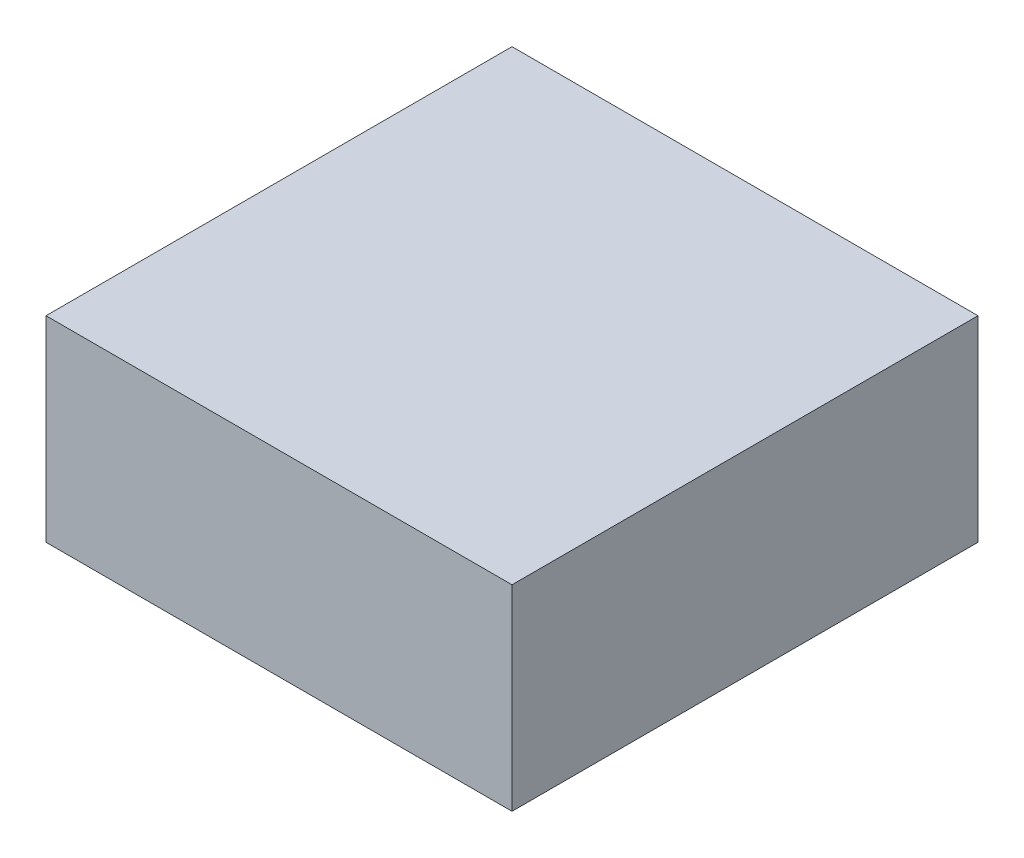
ISO-10303-21;
HEADER;
FILE_DESCRIPTION(('STEP AP214'),'2;1');
FILE_NAME('part.step','',(''),(''),'','','');
FILE_SCHEMA(('AUTOMOTIVE_DESIGN { 1 0 10303 214 1 1 1 1 }'));
ENDSEC;
DATA;
#1=APPLICATION_CONTEXT('core data for automotive mechanical design processes');
#2=APPLICATION_PROTOCOL_DEFINITION('international standard','automotive_design',2000,#1);
#3=PRODUCT_CONTEXT('',#1,'mechanical');
#4=PRODUCT('Part','Part','',(#3));
#5=PRODUCT_RELATED_PRODUCT_CATEGORY('part','',(#4));
#6=PRODUCT_DEFINITION_FORMATION('','',#4);
#7=PRODUCT_DEFINITION_CONTEXT('part definition',#1,'design');
#8=PRODUCT_DEFINITION('design','',#6,#7);
#9=PRODUCT_DEFINITION_SHAPE('','',#8);
#10=(LENGTH_UNIT() NAMED_UNIT(*) SI_UNIT(.MILLI.,.METRE.));
#11=(NAMED_UNIT(*) PLANE_ANGLE_UNIT() SI_UNIT($,.RADIAN.));
#12=(NAMED_UNIT(*) SI_UNIT($,.STERADIAN.) SOLID_ANGLE_UNIT());
#13=UNCERTAINTY_MEASURE_WITH_UNIT(LENGTH_MEASURE(1.E-05),#10,'distance_accuracy_value','');
#14=(GEOMETRIC_REPRESENTATION_CONTEXT(3) GLOBAL_UNCERTAINTY_ASSIGNED_CONTEXT((#13)) GLOBAL_UNIT_ASSIGNED_CONTEXT((#10,
#11,#12)) REPRESENTATION_CONTEXT('',''));
#15=CARTESIAN_POINT('',(0.,0.,0.));
#16=DIRECTION('',(0.,0.,1.));
#17=DIRECTION('',(1.,0.,0.));
#18=AXIS2_PLACEMENT_3D('',#15,#16,#17);
#19=CARTESIAN_POINT('',(0.47500032,0.20000214,0.));
#20=DIRECTION('',(0.,-1.,0.));
#21=DIRECTION('',(0.,0.,-1.));
#22=AXIS2_PLACEMENT_3D('',#19,#20,#21);
#23=PLANE('',#22);
#24=DIRECTION('',(0.,0.,-1.));
#25=VECTOR('',#24,1.);
#26=CARTESIAN_POINT('',(-0.47499778,0.20000214,0.));
#27=LINE('',#26,#25);
#28=CARTESIAN_POINT('',(-0.47499778,0.20000214,0.));
#29=VERTEX_POINT('',#28);
#30=CARTESIAN_POINT('',(-0.47499778,0.20000214,0.95000064));
#31=VERTEX_POINT('',#30);
#32=EDGE_CURVE('E20',#29,#31,#27,.F.);
#33=ORIENTED_EDGE('',*,*,#32,.T.);
#34=DIRECTION('',(-1.,0.,0.));
#35=VECTOR('',#34,1.);
#36=CARTESIAN_POINT('',(-0.47499778,0.20000214,0.95000064));
#37=LINE('',#36,#35);
#38=CARTESIAN_POINT('',(0.47500032,0.20000214,0.95000064));
#39=VERTEX_POINT('',#38);
#40=EDGE_CURVE('E55',#31,#39,#37,.F.);
#41=ORIENTED_EDGE('',*,*,#40,.T.);
#42=DIRECTION('',(0.,0.,1.));
#43=VECTOR('',#42,1.);
#44=CARTESIAN_POINT('',(0.47500032,0.20000214,0.));
#45=LINE('',#44,#43);
#46=CARTESIAN_POINT('',(0.47500032,0.20000214,0.));
#47=VERTEX_POINT('',#46);
#48=EDGE_CURVE('E76',#39,#47,#45,.F.);
#49=ORIENTED_EDGE('',*,*,#48,.T.);
#50=DIRECTION('',(-1.,0.,0.));
#51=VECTOR('',#50,1.);
#52=CARTESIAN_POINT('',(-0.47499778,0.20000214,0.));
#53=LINE('',#52,#51);
#54=EDGE_CURVE('E58',#29,#47,#53,.F.);
#55=ORIENTED_EDGE('',*,*,#54,.F.);
#56=EDGE_LOOP('',(#33,#41,#49,#55));
#57=FACE_BOUND('',#56,.T.);
#58=ADVANCED_FACE('F17',(#57),#23,.F.);
#59=CARTESIAN_POINT('',(-0.47499778,0.20000214,0.));
#60=DIRECTION('',(1.,0.,0.));
#61=DIRECTION('',(0.,0.,-1.));
#62=AXIS2_PLACEMENT_3D('',#59,#60,#61);
#63=PLANE('',#62);
#64=DIRECTION('',(0.,0.,1.));
#65=VECTOR('',#64,1.);
#66=CARTESIAN_POINT('',(-0.47499778,-0.1999996,0.));
#67=LINE('',#66,#65);
#68=CARTESIAN_POINT('',(-0.47499778,-0.1999996,0.));
#69=VERTEX_POINT('',#68);
#70=CARTESIAN_POINT('',(-0.47499778,-0.1999996,0.95000064));
#71=VERTEX_POINT('',#70);
#72=EDGE_CURVE('E73',#69,#71,#67,.T.);
#73=ORIENTED_EDGE('',*,*,#72,.T.);
#74=DIRECTION('',(0.,1.,0.));
#75=VECTOR('',#74,1.);
#76=CARTESIAN_POINT('',(-0.47499778,-0.1999996,0.95000064));
#77=LINE('',#76,#75);
#78=EDGE_CURVE('E63',#71,#31,#77,.T.);
#79=ORIENTED_EDGE('',*,*,#78,.T.);
#80=ORIENTED_EDGE('',*,*,#32,.F.);
#81=DIRECTION('',(0.,1.,0.));
#82=VECTOR('',#81,1.);
#83=CARTESIAN_POINT('',(-0.47499778,-0.1999996,0.));
#84=LINE('',#83,#82);
#85=EDGE_CURVE('E78',#69,#29,#84,.T.);
#86=ORIENTED_EDGE('',*,*,#85,.F.);
#87=EDGE_LOOP('',(#73,#79,#80,#86));
#88=FACE_BOUND('',#87,.T.);
#89=ADVANCED_FACE('F72',(#88),#63,.F.);
#90=CARTESIAN_POINT('',(-0.47499778,-0.1999996,0.95000064));
#91=DIRECTION('',(0.,0.,-1.));
#92=DIRECTION('',(-1.,0.,0.));
#93=AXIS2_PLACEMENT_3D('',#90,#91,#92);
#94=PLANE('',#93);
#95=DIRECTION('',(0.,1.,0.));
#96=VECTOR('',#95,1.);
#97=CARTESIAN_POINT('',(0.47500032,-0.1999996,0.95000064));
#98=LINE('',#97,#96);
#99=CARTESIAN_POINT('',(0.47500032,-0.1999996,0.95000064));
#100=VERTEX_POINT('',#99);
#101=EDGE_CURVE('E69',#100,#39,#98,.T.);
#102=ORIENTED_EDGE('',*,*,#101,.T.);
#103=ORIENTED_EDGE('',*,*,#40,.F.);
#104=ORIENTED_EDGE('',*,*,#78,.F.);
#105=DIRECTION('',(1.,0.,0.));
#106=VECTOR('',#105,1.);
#107=CARTESIAN_POINT('',(-0.47499778,-0.1999996,0.95000064));
#108=LINE('',#107,#106);
#109=EDGE_CURVE('E83',#71,#100,#108,.T.);
#110=ORIENTED_EDGE('',*,*,#109,.T.);
#111=EDGE_LOOP('',(#102,#103,#104,#110));
#112=FACE_BOUND('',#111,.T.);
#113=ADVANCED_FACE('F66',(#112),#94,.F.);
#114=CARTESIAN_POINT('',(0.47500032,-0.1999996,0.));
#115=DIRECTION('',(-1.,0.,0.));
#116=DIRECTION('',(0.,0.,1.));
#117=AXIS2_PLACEMENT_3D('',#114,#115,#116);
#118=PLANE('',#117);
#119=ORIENTED_EDGE('',*,*,#48,.F.);
#120=ORIENTED_EDGE('',*,*,#101,.F.);
#121=DIRECTION('',(0.,0.,1.));
#122=VECTOR('',#121,1.);
#123=CARTESIAN_POINT('',(0.47500032,-0.1999996,0.));
#124=LINE('',#123,#122);
#125=CARTESIAN_POINT('',(0.47500032,-0.1999996,0.));
#126=VERTEX_POINT('',#125);
#127=EDGE_CURVE('E26',#100,#126,#124,.F.);
#128=ORIENTED_EDGE('',*,*,#127,.T.);
#129=DIRECTION('',(0.,1.,0.));
#130=VECTOR('',#129,1.);
#131=CARTESIAN_POINT('',(0.47500032,-0.1999996,0.));
#132=LINE('',#131,#130);
#133=EDGE_CURVE('E34',#47,#126,#132,.F.);
#134=ORIENTED_EDGE('',*,*,#133,.F.);
#135=EDGE_LOOP('',(#119,#120,#128,#134));
#136=FACE_BOUND('',#135,.T.);
#137=ADVANCED_FACE('F88',(#136),#118,.F.);
#138=CARTESIAN_POINT('',(-0.47499778,-0.1999996,0.));
#139=DIRECTION('',(0.,0.,-1.));
#140=DIRECTION('',(-1.,0.,0.));
#141=AXIS2_PLACEMENT_3D('',#138,#139,#140);
#142=PLANE('',#141);
#143=ORIENTED_EDGE('',*,*,#133,.T.);
#144=DIRECTION('',(1.,0.,0.));
#145=VECTOR('',#144,1.);
#146=CARTESIAN_POINT('',(-0.47499778,-0.1999996,0.));
#147=LINE('',#146,#145);
#148=EDGE_CURVE('E11',#126,#69,#147,.F.);
#149=ORIENTED_EDGE('',*,*,#148,.T.);
#150=ORIENTED_EDGE('',*,*,#85,.T.);
#151=ORIENTED_EDGE('',*,*,#54,.T.);
#152=EDGE_LOOP('',(#143,#149,#150,#151));
#153=FACE_BOUND('',#152,.T.);
#154=ADVANCED_FACE('F91',(#153),#142,.T.);
#155=CARTESIAN_POINT('',(-0.47499778,-0.1999996,0.));
#156=DIRECTION('',(0.,1.,0.));
#157=DIRECTION('',(0.,0.,1.));
#158=AXIS2_PLACEMENT_3D('',#155,#156,#157);
#159=PLANE('',#158);
#160=ORIENTED_EDGE('',*,*,#127,.F.);
#161=ORIENTED_EDGE('',*,*,#109,.F.);
#162=ORIENTED_EDGE('',*,*,#72,.F.);
#163=ORIENTED_EDGE('',*,*,#148,.F.);
#164=EDGE_LOOP('',(#160,#161,#162,#163));
#165=FACE_BOUND('',#164,.T.);
#166=ADVANCED_FACE('F90',(#165),#159,.F.);
#167=CLOSED_SHELL('',(#58,#89,#113,#137,#154,#166));
#168=MANIFOLD_SOLID_BREP('B1',#167);
#169=ADVANCED_BREP_SHAPE_REPRESENTATION('',(#18,#168),#14);
#170=SHAPE_DEFINITION_REPRESENTATION(#9,#169);
ENDSEC;
END-ISO-10303-21;
